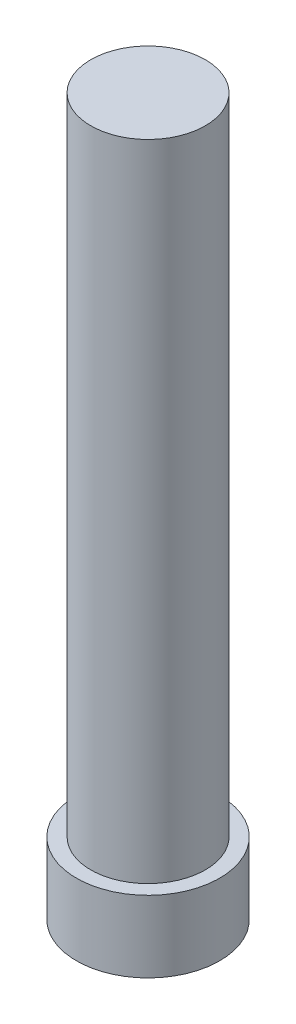
ISO-10303-21;
HEADER;
FILE_DESCRIPTION(('STEP AP214'),'2;1');
FILE_NAME('part.step','',(''),(''),'','','');
FILE_SCHEMA(('AUTOMOTIVE_DESIGN { 1 0 10303 214 1 1 1 1 }'));
ENDSEC;
DATA;
#1=APPLICATION_CONTEXT('core data for automotive mechanical design processes');
#2=APPLICATION_PROTOCOL_DEFINITION('international standard','automotive_design',2000,#1);
#3=PRODUCT_CONTEXT('',#1,'mechanical');
#4=PRODUCT('Part','Part','',(#3));
#5=PRODUCT_RELATED_PRODUCT_CATEGORY('part','',(#4));
#6=PRODUCT_DEFINITION_FORMATION('','',#4);
#7=PRODUCT_DEFINITION_CONTEXT('part definition',#1,'design');
#8=PRODUCT_DEFINITION('design','',#6,#7);
#9=PRODUCT_DEFINITION_SHAPE('','',#8);
#10=(LENGTH_UNIT() NAMED_UNIT(*) SI_UNIT(.MILLI.,.METRE.));
#11=(NAMED_UNIT(*) PLANE_ANGLE_UNIT() SI_UNIT($,.RADIAN.));
#12=(NAMED_UNIT(*) SI_UNIT($,.STERADIAN.) SOLID_ANGLE_UNIT());
#13=UNCERTAINTY_MEASURE_WITH_UNIT(LENGTH_MEASURE(1.E-05),#10,'distance_accuracy_value','');
#14=(GEOMETRIC_REPRESENTATION_CONTEXT(3) GLOBAL_UNCERTAINTY_ASSIGNED_CONTEXT((#13)) GLOBAL_UNIT_ASSIGNED_CONTEXT((#10,
#11,#12)) REPRESENTATION_CONTEXT('',''));
#15=CARTESIAN_POINT('',(0.,0.,0.));
#16=DIRECTION('',(0.,0.,1.));
#17=DIRECTION('',(1.,0.,0.));
#18=AXIS2_PLACEMENT_3D('',#15,#16,#17);
#19=CARTESIAN_POINT('',(0.,45.,0.));
#20=DIRECTION('',(0.,-1.,0.));
#21=DIRECTION('',(0.,0.,-1.));
#22=AXIS2_PLACEMENT_3D('',#19,#20,#21);
#23=CYLINDRICAL_SURFACE('',#22,4.);
#24=CARTESIAN_POINT('',(0.,45.,0.));
#25=DIRECTION('',(0.,1.,0.));
#26=DIRECTION('',(0.,0.,1.));
#27=AXIS2_PLACEMENT_3D('',#24,#25,#26);
#28=CIRCLE('',#27,4.);
#29=CARTESIAN_POINT('',(0.,45.,-4.));
#30=VERTEX_POINT('',#29);
#31=EDGE_CURVE('E10',#30,#30,#28,.T.);
#32=CARTESIAN_POINT('',(0.,0.,0.));
#33=DIRECTION('',(0.,1.,0.));
#34=DIRECTION('',(0.,0.,1.));
#35=AXIS2_PLACEMENT_3D('',#32,#33,#34);
#36=CIRCLE('',#35,4.);
#37=CARTESIAN_POINT('',(0.,0.,-4.));
#38=VERTEX_POINT('',#37);
#39=EDGE_CURVE('E40',#38,#38,#36,.T.);
#40=CARTESIAN_POINT('',(0.,45.,-4.));
#41=CARTESIAN_POINT('',(0.,44.53125,-4.));
#42=CARTESIAN_POINT('',(0.,44.0625,-4.));
#43=CARTESIAN_POINT('',(0.,43.125,-4.));
#44=CARTESIAN_POINT('',(0.,42.65625,-4.));
#45=CARTESIAN_POINT('',(0.,41.71875,-4.));
#46=CARTESIAN_POINT('',(0.,41.25,-4.));
#47=CARTESIAN_POINT('',(0.,40.3125,-4.));
#48=CARTESIAN_POINT('',(0.,39.84375,-4.));
#49=CARTESIAN_POINT('',(0.,38.90625,-4.));
#50=CARTESIAN_POINT('',(0.,38.4375,-4.));
#51=CARTESIAN_POINT('',(0.,37.5,-4.));
#52=CARTESIAN_POINT('',(0.,37.03125,-4.));
#53=CARTESIAN_POINT('',(0.,36.09375,-4.));
#54=CARTESIAN_POINT('',(0.,35.625,-4.));
#55=CARTESIAN_POINT('',(0.,34.6875,-4.));
#56=CARTESIAN_POINT('',(0.,34.21875,-4.));
#57=CARTESIAN_POINT('',(0.,33.28125,-4.));
#58=CARTESIAN_POINT('',(0.,32.8125,-4.));
#59=CARTESIAN_POINT('',(0.,31.875,-4.));
#60=CARTESIAN_POINT('',(0.,31.40625,-4.));
#61=CARTESIAN_POINT('',(0.,30.46875,-4.));
#62=CARTESIAN_POINT('',(0.,30.,-4.));
#63=CARTESIAN_POINT('',(0.,29.0625,-4.));
#64=CARTESIAN_POINT('',(0.,28.59375,-4.));
#65=CARTESIAN_POINT('',(0.,27.65625,-4.));
#66=CARTESIAN_POINT('',(0.,27.1875,-4.));
#67=CARTESIAN_POINT('',(0.,26.25,-4.));
#68=CARTESIAN_POINT('',(0.,25.78125,-4.));
#69=CARTESIAN_POINT('',(0.,24.84375,-4.));
#70=CARTESIAN_POINT('',(0.,24.375,-4.));
#71=CARTESIAN_POINT('',(0.,23.4375,-4.));
#72=CARTESIAN_POINT('',(0.,22.96875,-4.));
#73=CARTESIAN_POINT('',(0.,22.03125,-4.));
#74=CARTESIAN_POINT('',(0.,21.5625,-4.));
#75=CARTESIAN_POINT('',(0.,20.625,-4.));
#76=CARTESIAN_POINT('',(0.,20.15625,-4.));
#77=CARTESIAN_POINT('',(0.,19.21875,-4.));
#78=CARTESIAN_POINT('',(0.,18.75,-4.));
#79=CARTESIAN_POINT('',(0.,17.8125,-4.));
#80=CARTESIAN_POINT('',(0.,17.34375,-4.));
#81=CARTESIAN_POINT('',(0.,16.40625,-4.));
#82=CARTESIAN_POINT('',(0.,15.9375,-4.));
#83=CARTESIAN_POINT('',(0.,15.,-4.));
#84=CARTESIAN_POINT('',(0.,14.53125,-4.));
#85=CARTESIAN_POINT('',(0.,13.59375,-4.));
#86=CARTESIAN_POINT('',(0.,13.125,-4.));
#87=CARTESIAN_POINT('',(0.,12.1875,-4.));
#88=CARTESIAN_POINT('',(0.,11.71875,-4.));
#89=CARTESIAN_POINT('',(0.,10.78125,-4.));
#90=CARTESIAN_POINT('',(0.,10.3125,-4.));
#91=CARTESIAN_POINT('',(0.,9.37499999999999,-4.));
#92=CARTESIAN_POINT('',(0.,8.90624999999999,-4.));
#93=CARTESIAN_POINT('',(0.,7.96874999999999,-4.));
#94=CARTESIAN_POINT('',(0.,7.5,-4.));
#95=CARTESIAN_POINT('',(0.,6.56249999999999,-4.));
#96=CARTESIAN_POINT('',(0.,6.09374999999999,-4.));
#97=CARTESIAN_POINT('',(0.,5.15624999999999,-4.));
#98=CARTESIAN_POINT('',(0.,4.68749999999999,-4.));
#99=CARTESIAN_POINT('',(0.,3.74999999999999,-4.));
#100=CARTESIAN_POINT('',(0.,3.28124999999999,-4.));
#101=CARTESIAN_POINT('',(0.,2.34374999999999,-4.));
#102=CARTESIAN_POINT('',(0.,1.87499999999999,-4.));
#103=CARTESIAN_POINT('',(0.,0.937499999999992,-4.));
#104=CARTESIAN_POINT('',(0.,0.468749999999993,-4.));
#105=CARTESIAN_POINT('',(0.,0.,-4.));
#106=B_SPLINE_CURVE_WITH_KNOTS('',3,(#40,#41,#42,#43,#44,#45,#46,#47,#48,#49,#50,#51,#52,#53,
#54,#55,#56,#57,#58,#59,#60,#61,#62,#63,#64,#65,#66,#67,#68,#69,#70,#71,#72,#73,#74,#75,#76,#77,
#78,#79,#80,#81,#82,#83,#84,#85,#86,#87,#88,#89,#90,#91,#92,#93,#94,#95,#96,#97,#98,#99,#100,
#101,#102,#103,#104,#105),.UNSPECIFIED.,.F.,.F.,(4,2,2,2,2,2,2,2,2,2,2,2,2,2,2,2,2,2,2,2,2,2,2,
2,2,2,2,2,2,2,2,2,4),(0.,1.40625,2.8125,4.21874999999999,5.625,7.03125,8.43749999999999,9.84375,
11.25,12.65625,14.0625,15.46875,16.875,18.28125,19.6875,21.09375,22.5,23.90625,25.3125,26.71875,
28.125,29.53125,30.9375,32.34375,33.75,35.15625,36.5625,37.96875,39.375,40.78125,42.1875,
43.59375,45.),.UNSPECIFIED.);
#107=EDGE_CURVE('BSEAM37',#30,#38,#106,.T.);
#108=ORIENTED_EDGE('',*,*,#31,.F.);
#109=ORIENTED_EDGE('',*,*,#39,.T.);
#110=ORIENTED_EDGE('',*,*,#107,.T.);
#111=ORIENTED_EDGE('',*,*,#107,.F.);
#112=EDGE_LOOP('',(#108,#110,#109,#111));
#113=FACE_BOUND('',#112,.T.);
#114=ADVANCED_FACE('F37',(#113),#23,.T.);
#115=CARTESIAN_POINT('',(0.,45.,0.));
#116=DIRECTION('',(0.,1.,0.));
#117=DIRECTION('',(0.,0.,1.));
#118=AXIS2_PLACEMENT_3D('',#115,#116,#117);
#119=PLANE('',#118);
#120=ORIENTED_EDGE('',*,*,#31,.T.);
#121=EDGE_LOOP('',(#120));
#122=FACE_BOUND('',#121,.T.);
#123=ADVANCED_FACE('F64',(#122),#119,.T.);
#124=CARTESIAN_POINT('',(0.,-5.,0.));
#125=DIRECTION('',(0.,1.,0.));
#126=DIRECTION('',(0.,0.,1.));
#127=AXIS2_PLACEMENT_3D('',#124,#125,#126);
#128=CYLINDRICAL_SURFACE('',#127,5.);
#129=CARTESIAN_POINT('',(0.,-5.,0.));
#130=DIRECTION('',(0.,-1.,0.));
#131=DIRECTION('',(0.,0.,-1.));
#132=AXIS2_PLACEMENT_3D('',#129,#130,#131);
#133=CIRCLE('',#132,5.);
#134=CARTESIAN_POINT('',(0.,-5.,-5.));
#135=VERTEX_POINT('',#134);
#136=EDGE_CURVE('E49',#135,#135,#133,.T.);
#137=ORIENTED_EDGE('',*,*,#136,.F.);
#138=EDGE_LOOP('',(#137));
#139=FACE_BOUND('',#138,.T.);
#140=CARTESIAN_POINT('',(0.,0.,0.));
#141=DIRECTION('',(0.,-1.,0.));
#142=DIRECTION('',(0.,0.,-1.));
#143=AXIS2_PLACEMENT_3D('',#140,#141,#142);
#144=CIRCLE('',#143,5.);
#145=CARTESIAN_POINT('',(0.,0.,-5.));
#146=VERTEX_POINT('',#145);
#147=EDGE_CURVE('E51',#146,#146,#144,.T.);
#148=ORIENTED_EDGE('',*,*,#147,.T.);
#149=EDGE_LOOP('',(#148));
#150=FACE_BOUND('',#149,.T.);
#151=ADVANCED_FACE('F61',(#139,#150),#128,.T.);
#152=CARTESIAN_POINT('',(0.,-5.,0.));
#153=DIRECTION('',(0.,-1.,0.));
#154=DIRECTION('',(0.,0.,-1.));
#155=AXIS2_PLACEMENT_3D('',#152,#153,#154);
#156=PLANE('',#155);
#157=ORIENTED_EDGE('',*,*,#136,.T.);
#158=EDGE_LOOP('',(#157));
#159=FACE_BOUND('',#158,.T.);
#160=ADVANCED_FACE('F59',(#159),#156,.T.);
#161=CARTESIAN_POINT('',(0.,0.,0.));
#162=DIRECTION('',(0.,-1.,0.));
#163=DIRECTION('',(0.,0.,-1.));
#164=AXIS2_PLACEMENT_3D('',#161,#162,#163);
#165=PLANE('',#164);
#166=ORIENTED_EDGE('',*,*,#39,.F.);
#167=EDGE_LOOP('',(#166));
#168=FACE_BOUND('',#167,.T.);
#169=ORIENTED_EDGE('',*,*,#147,.F.);
#170=EDGE_LOOP('',(#169));
#171=FACE_BOUND('',#170,.T.);
#172=ADVANCED_FACE('F68',(#168,#171),#165,.F.);
#173=CLOSED_SHELL('',(#114,#123,#151,#160,#172));
#174=MANIFOLD_SOLID_BREP('B2',#173);
#175=ADVANCED_BREP_SHAPE_REPRESENTATION('',(#18,#174),#14);
#176=SHAPE_DEFINITION_REPRESENTATION(#9,#175);
ENDSEC;
END-ISO-10303-21;
